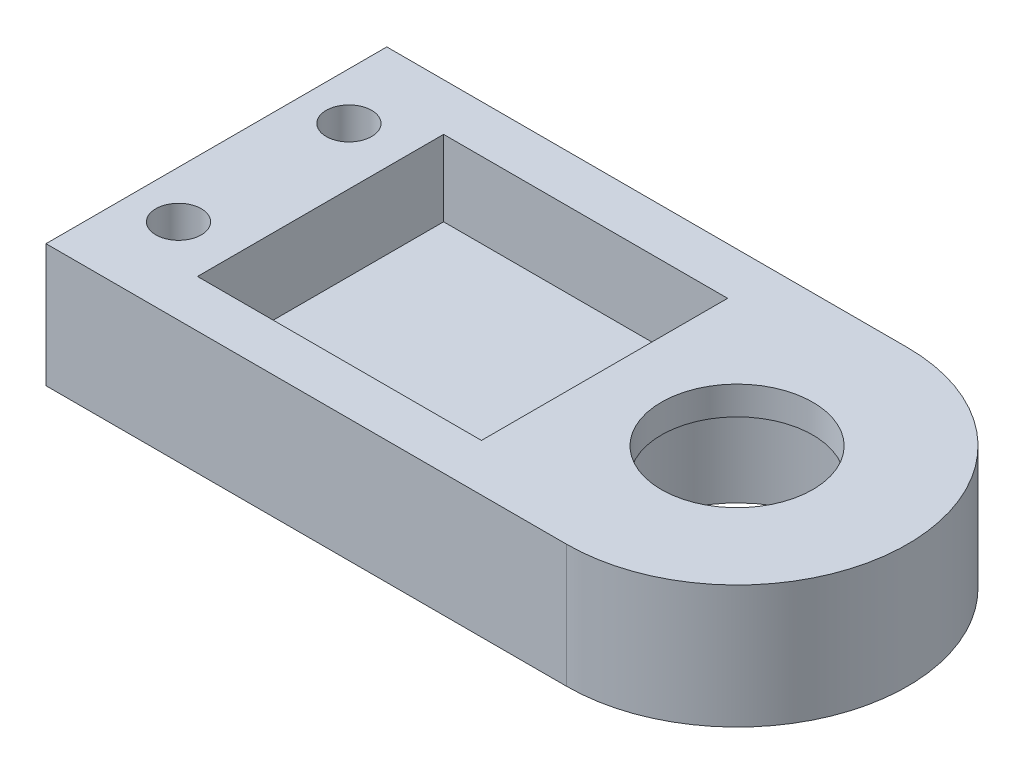
ISO-10303-21;
HEADER;
FILE_DESCRIPTION(('STEP AP214'),'2;1');
FILE_NAME('part.step','',(''),(''),'','','');
FILE_SCHEMA(('AUTOMOTIVE_DESIGN { 1 0 10303 214 1 1 1 1 }'));
ENDSEC;
DATA;
#1=APPLICATION_CONTEXT('core data for automotive mechanical design processes');
#2=APPLICATION_PROTOCOL_DEFINITION('international standard','automotive_design',2000,#1);
#3=PRODUCT_CONTEXT('',#1,'mechanical');
#4=PRODUCT('Part','Part','',(#3));
#5=PRODUCT_RELATED_PRODUCT_CATEGORY('part','',(#4));
#6=PRODUCT_DEFINITION_FORMATION('','',#4);
#7=PRODUCT_DEFINITION_CONTEXT('part definition',#1,'design');
#8=PRODUCT_DEFINITION('design','',#6,#7);
#9=PRODUCT_DEFINITION_SHAPE('','',#8);
#10=(LENGTH_UNIT() NAMED_UNIT(*) SI_UNIT(.MILLI.,.METRE.));
#11=(NAMED_UNIT(*) PLANE_ANGLE_UNIT() SI_UNIT($,.RADIAN.));
#12=(NAMED_UNIT(*) SI_UNIT($,.STERADIAN.) SOLID_ANGLE_UNIT());
#13=UNCERTAINTY_MEASURE_WITH_UNIT(LENGTH_MEASURE(1.E-05),#10,'distance_accuracy_value','');
#14=(GEOMETRIC_REPRESENTATION_CONTEXT(3) GLOBAL_UNCERTAINTY_ASSIGNED_CONTEXT((#13)) GLOBAL_UNIT_ASSIGNED_CONTEXT((#10,
#11,#12)) REPRESENTATION_CONTEXT('',''));
#15=CARTESIAN_POINT('',(0.,0.,0.));
#16=DIRECTION('',(0.,0.,1.));
#17=DIRECTION('',(1.,0.,0.));
#18=AXIS2_PLACEMENT_3D('',#15,#16,#17);
#19=CARTESIAN_POINT('',(5.5,31.3,0.));
#20=DIRECTION('',(0.,-1.,0.));
#21=DIRECTION('',(0.,0.,-1.));
#22=AXIS2_PLACEMENT_3D('',#19,#20,#21);
#23=CYLINDRICAL_SURFACE('',#22,9.);
#24=CARTESIAN_POINT('',(5.5,24.8,0.));
#25=DIRECTION('',(0.,1.,0.));
#26=DIRECTION('',(0.,0.,1.));
#27=AXIS2_PLACEMENT_3D('',#24,#25,#26);
#28=CIRCLE('',#27,9.);
#29=CARTESIAN_POINT('',(5.5,24.8,9.));
#30=VERTEX_POINT('',#29);
#31=CARTESIAN_POINT('',(5.5,24.8,-9.));
#32=VERTEX_POINT('',#31);
#33=EDGE_CURVE('E192',#30,#32,#28,.T.);
#34=ORIENTED_EDGE('',*,*,#33,.T.);
#35=DIRECTION('',(0.,-1.,0.));
#36=VECTOR('',#35,1.);
#37=CARTESIAN_POINT('',(5.5,31.3,-9.));
#38=LINE('',#37,#36);
#39=CARTESIAN_POINT('',(5.5,31.3,-9.));
#40=VERTEX_POINT('',#39);
#41=EDGE_CURVE('E11',#40,#32,#38,.T.);
#42=ORIENTED_EDGE('',*,*,#41,.F.);
#43=CARTESIAN_POINT('',(5.5,31.3,0.));
#44=DIRECTION('',(0.,1.,0.));
#45=DIRECTION('',(0.,0.,1.));
#46=AXIS2_PLACEMENT_3D('',#43,#44,#45);
#47=CIRCLE('',#46,9.);
#48=CARTESIAN_POINT('',(5.5,31.3,9.));
#49=VERTEX_POINT('',#48);
#50=EDGE_CURVE('E196',#49,#40,#47,.T.);
#51=ORIENTED_EDGE('',*,*,#50,.F.);
#52=DIRECTION('',(0.,-1.,0.));
#53=VECTOR('',#52,1.);
#54=CARTESIAN_POINT('',(5.5,31.3,9.));
#55=LINE('',#54,#53);
#56=EDGE_CURVE('E206',#49,#30,#55,.T.);
#57=ORIENTED_EDGE('',*,*,#56,.T.);
#58=EDGE_LOOP('',(#34,#42,#51,#57));
#59=FACE_BOUND('',#58,.T.);
#60=ADVANCED_FACE('F39',(#59),#23,.T.);
#61=CARTESIAN_POINT('',(5.5,31.3,-9.));
#62=DIRECTION('',(0.,0.,1.));
#63=DIRECTION('',(1.,0.,0.));
#64=AXIS2_PLACEMENT_3D('',#61,#62,#63);
#65=PLANE('',#64);
#66=DIRECTION('',(-1.,0.,0.));
#67=VECTOR('',#66,1.);
#68=CARTESIAN_POINT('',(5.5,24.8,-9.));
#69=LINE('',#68,#67);
#70=CARTESIAN_POINT('',(-22.,24.8,-9.));
#71=VERTEX_POINT('',#70);
#72=EDGE_CURVE('E210',#32,#71,#69,.T.);
#73=ORIENTED_EDGE('',*,*,#72,.T.);
#74=DIRECTION('',(0.,-1.,0.));
#75=VECTOR('',#74,1.);
#76=CARTESIAN_POINT('',(-22.,31.3,-9.));
#77=LINE('',#76,#75);
#78=CARTESIAN_POINT('',(-22.,31.3,-9.));
#79=VERTEX_POINT('',#78);
#80=EDGE_CURVE('E47',#79,#71,#77,.T.);
#81=ORIENTED_EDGE('',*,*,#80,.F.);
#82=DIRECTION('',(-1.,0.,0.));
#83=VECTOR('',#82,1.);
#84=CARTESIAN_POINT('',(5.5,31.3,-9.));
#85=LINE('',#84,#83);
#86=EDGE_CURVE('E91',#40,#79,#85,.T.);
#87=ORIENTED_EDGE('',*,*,#86,.F.);
#88=ORIENTED_EDGE('',*,*,#41,.T.);
#89=EDGE_LOOP('',(#73,#81,#87,#88));
#90=FACE_BOUND('',#89,.T.);
#91=ADVANCED_FACE('F245',(#90),#65,.F.);
#92=CARTESIAN_POINT('',(-22.,31.3,-9.));
#93=DIRECTION('',(1.,0.,0.));
#94=DIRECTION('',(0.,0.,-1.));
#95=AXIS2_PLACEMENT_3D('',#92,#93,#94);
#96=PLANE('',#95);
#97=DIRECTION('',(0.,0.,1.));
#98=VECTOR('',#97,1.);
#99=CARTESIAN_POINT('',(-22.,24.8,-9.));
#100=LINE('',#99,#98);
#101=CARTESIAN_POINT('',(-22.,24.8,9.));
#102=VERTEX_POINT('',#101);
#103=EDGE_CURVE('E213',#71,#102,#100,.T.);
#104=ORIENTED_EDGE('',*,*,#103,.T.);
#105=DIRECTION('',(0.,-1.,0.));
#106=VECTOR('',#105,1.);
#107=CARTESIAN_POINT('',(-22.,31.3,9.));
#108=LINE('',#107,#106);
#109=CARTESIAN_POINT('',(-22.,31.3,9.));
#110=VERTEX_POINT('',#109);
#111=EDGE_CURVE('E220',#110,#102,#108,.T.);
#112=ORIENTED_EDGE('',*,*,#111,.F.);
#113=DIRECTION('',(0.,0.,1.));
#114=VECTOR('',#113,1.);
#115=CARTESIAN_POINT('',(-22.,31.3,-9.));
#116=LINE('',#115,#114);
#117=EDGE_CURVE('E201',#79,#110,#116,.T.);
#118=ORIENTED_EDGE('',*,*,#117,.F.);
#119=ORIENTED_EDGE('',*,*,#80,.T.);
#120=EDGE_LOOP('',(#104,#112,#118,#119));
#121=FACE_BOUND('',#120,.T.);
#122=ADVANCED_FACE('F227',(#121),#96,.F.);
#123=CARTESIAN_POINT('',(-22.,31.3,9.));
#124=DIRECTION('',(0.,0.,-1.));
#125=DIRECTION('',(-1.,0.,0.));
#126=AXIS2_PLACEMENT_3D('',#123,#124,#125);
#127=PLANE('',#126);
#128=DIRECTION('',(1.,0.,0.));
#129=VECTOR('',#128,1.);
#130=CARTESIAN_POINT('',(-22.,24.8,9.));
#131=LINE('',#130,#129);
#132=EDGE_CURVE('E84',#102,#30,#131,.T.);
#133=ORIENTED_EDGE('',*,*,#132,.T.);
#134=ORIENTED_EDGE('',*,*,#56,.F.);
#135=DIRECTION('',(1.,0.,0.));
#136=VECTOR('',#135,1.);
#137=CARTESIAN_POINT('',(-22.,31.3,9.));
#138=LINE('',#137,#136);
#139=EDGE_CURVE('E63',#110,#49,#138,.T.);
#140=ORIENTED_EDGE('',*,*,#139,.F.);
#141=ORIENTED_EDGE('',*,*,#111,.T.);
#142=EDGE_LOOP('',(#133,#134,#140,#141));
#143=FACE_BOUND('',#142,.T.);
#144=ADVANCED_FACE('F235',(#143),#127,.F.);
#145=CARTESIAN_POINT('',(5.5,31.3,0.));
#146=DIRECTION('',(0.,1.,0.));
#147=DIRECTION('',(0.,0.,1.));
#148=AXIS2_PLACEMENT_3D('',#145,#146,#147);
#149=PLANE('',#148);
#150=DIRECTION('',(0.,0.,1.));
#151=VECTOR('',#150,1.);
#152=CARTESIAN_POINT('',(-16.5,31.3,6.5));
#153=LINE('',#152,#151);
#154=CARTESIAN_POINT('',(-16.5,31.3,-6.5));
#155=VERTEX_POINT('',#154);
#156=CARTESIAN_POINT('',(-16.5,31.3,6.5));
#157=VERTEX_POINT('',#156);
#158=EDGE_CURVE('E54',#155,#157,#153,.T.);
#159=ORIENTED_EDGE('',*,*,#158,.F.);
#160=DIRECTION('',(-1.,0.,0.));
#161=VECTOR('',#160,1.);
#162=CARTESIAN_POINT('',(-16.5,31.3,-6.5));
#163=LINE('',#162,#161);
#164=CARTESIAN_POINT('',(-1.5,31.3,-6.5));
#165=VERTEX_POINT('',#164);
#166=EDGE_CURVE('E136',#165,#155,#163,.T.);
#167=ORIENTED_EDGE('',*,*,#166,.F.);
#168=DIRECTION('',(0.,0.,-1.));
#169=VECTOR('',#168,1.);
#170=CARTESIAN_POINT('',(-1.5,31.3,6.5));
#171=LINE('',#170,#169);
#172=CARTESIAN_POINT('',(-1.5,31.3,6.5));
#173=VERTEX_POINT('',#172);
#174=EDGE_CURVE('E140',#173,#165,#171,.T.);
#175=ORIENTED_EDGE('',*,*,#174,.F.);
#176=DIRECTION('',(1.,0.,0.));
#177=VECTOR('',#176,1.);
#178=CARTESIAN_POINT('',(-16.5,31.3,6.5));
#179=LINE('',#178,#177);
#180=EDGE_CURVE('E149',#157,#173,#179,.T.);
#181=ORIENTED_EDGE('',*,*,#180,.F.);
#182=EDGE_LOOP('',(#159,#167,#175,#181));
#183=FACE_BOUND('',#182,.T.);
#184=CARTESIAN_POINT('',(-19.5,31.3,-4.5));
#185=DIRECTION('',(0.,1.,0.));
#186=DIRECTION('',(0.,0.,1.));
#187=AXIS2_PLACEMENT_3D('',#184,#185,#186);
#188=CIRCLE('',#187,1.19999999999999);
#189=CARTESIAN_POINT('',(-19.5,31.3,-3.30000000000001));
#190=VERTEX_POINT('',#189);
#191=EDGE_CURVE('E158',#190,#190,#188,.T.);
#192=ORIENTED_EDGE('',*,*,#191,.F.);
#193=EDGE_LOOP('',(#192));
#194=FACE_BOUND('',#193,.T.);
#195=CARTESIAN_POINT('',(-19.5,31.3,4.5));
#196=DIRECTION('',(0.,1.,0.));
#197=DIRECTION('',(0.,0.,1.));
#198=AXIS2_PLACEMENT_3D('',#195,#196,#197);
#199=CIRCLE('',#198,1.19999999999999);
#200=CARTESIAN_POINT('',(-19.5,31.3,5.69999999999999));
#201=VERTEX_POINT('',#200);
#202=EDGE_CURVE('E171',#201,#201,#199,.T.);
#203=ORIENTED_EDGE('',*,*,#202,.F.);
#204=EDGE_LOOP('',(#203));
#205=FACE_BOUND('',#204,.T.);
#206=CARTESIAN_POINT('',(5.5,31.3,0.));
#207=DIRECTION('',(0.,1.,0.));
#208=DIRECTION('',(0.,0.,1.));
#209=AXIS2_PLACEMENT_3D('',#206,#207,#208);
#210=CIRCLE('',#209,4.);
#211=CARTESIAN_POINT('',(5.5,31.3,4.));
#212=VERTEX_POINT('',#211);
#213=EDGE_CURVE('E180',#212,#212,#210,.T.);
#214=ORIENTED_EDGE('',*,*,#213,.F.);
#215=EDGE_LOOP('',(#214));
#216=FACE_BOUND('',#215,.T.);
#217=ORIENTED_EDGE('',*,*,#50,.T.);
#218=ORIENTED_EDGE('',*,*,#86,.T.);
#219=ORIENTED_EDGE('',*,*,#117,.T.);
#220=ORIENTED_EDGE('',*,*,#139,.T.);
#221=EDGE_LOOP('',(#217,#218,#219,#220));
#222=FACE_BOUND('',#221,.T.);
#223=ADVANCED_FACE('F237',(#183,#194,#205,#216,#222),#149,.T.);
#224=CARTESIAN_POINT('',(5.5,24.8,0.));
#225=DIRECTION('',(0.,1.,0.));
#226=DIRECTION('',(0.,0.,1.));
#227=AXIS2_PLACEMENT_3D('',#224,#225,#226);
#228=PLANE('',#227);
#229=CARTESIAN_POINT('',(-19.5,24.8,-4.5));
#230=DIRECTION('',(0.,1.,0.));
#231=DIRECTION('',(0.,0.,1.));
#232=AXIS2_PLACEMENT_3D('',#229,#230,#231);
#233=CIRCLE('',#232,1.19999999999999);
#234=CARTESIAN_POINT('',(-19.5,24.8,-3.30000000000001));
#235=VERTEX_POINT('',#234);
#236=EDGE_CURVE('E167',#235,#235,#233,.T.);
#237=ORIENTED_EDGE('',*,*,#236,.T.);
#238=EDGE_LOOP('',(#237));
#239=FACE_BOUND('',#238,.T.);
#240=CARTESIAN_POINT('',(-19.5,24.8,4.5));
#241=DIRECTION('',(0.,1.,0.));
#242=DIRECTION('',(0.,0.,1.));
#243=AXIS2_PLACEMENT_3D('',#240,#241,#242);
#244=CIRCLE('',#243,1.19999999999999);
#245=CARTESIAN_POINT('',(-19.5,24.8,5.69999999999999));
#246=VERTEX_POINT('',#245);
#247=EDGE_CURVE('E175',#246,#246,#244,.T.);
#248=ORIENTED_EDGE('',*,*,#247,.T.);
#249=EDGE_LOOP('',(#248));
#250=FACE_BOUND('',#249,.T.);
#251=CARTESIAN_POINT('',(5.5,24.8,0.));
#252=DIRECTION('',(0.,1.,0.));
#253=DIRECTION('',(0.,0.,1.));
#254=AXIS2_PLACEMENT_3D('',#251,#252,#253);
#255=CIRCLE('',#254,5.5);
#256=CARTESIAN_POINT('',(5.5,24.8,5.5));
#257=VERTEX_POINT('',#256);
#258=EDGE_CURVE('E184',#257,#257,#255,.T.);
#259=ORIENTED_EDGE('',*,*,#258,.T.);
#260=EDGE_LOOP('',(#259));
#261=FACE_BOUND('',#260,.T.);
#262=ORIENTED_EDGE('',*,*,#33,.F.);
#263=ORIENTED_EDGE('',*,*,#132,.F.);
#264=ORIENTED_EDGE('',*,*,#103,.F.);
#265=ORIENTED_EDGE('',*,*,#72,.F.);
#266=EDGE_LOOP('',(#262,#263,#264,#265));
#267=FACE_BOUND('',#266,.T.);
#268=ADVANCED_FACE('F231',(#239,#250,#261,#267),#228,.F.);
#269=CARTESIAN_POINT('',(5.5,29.8,0.));
#270=DIRECTION('',(0.,-1.,0.));
#271=DIRECTION('',(0.,0.,-1.));
#272=AXIS2_PLACEMENT_3D('',#269,#270,#271);
#273=CYLINDRICAL_SURFACE('',#272,5.5);
#274=CARTESIAN_POINT('',(5.5,29.8,0.));
#275=DIRECTION('',(0.,1.,0.));
#276=DIRECTION('',(0.,0.,1.));
#277=AXIS2_PLACEMENT_3D('',#274,#275,#276);
#278=CIRCLE('',#277,5.5);
#279=CARTESIAN_POINT('',(5.5,29.8,5.5));
#280=VERTEX_POINT('',#279);
#281=EDGE_CURVE('E188',#280,#280,#278,.T.);
#282=ORIENTED_EDGE('',*,*,#281,.T.);
#283=EDGE_LOOP('',(#282));
#284=FACE_BOUND('',#283,.T.);
#285=ORIENTED_EDGE('',*,*,#258,.F.);
#286=EDGE_LOOP('',(#285));
#287=FACE_BOUND('',#286,.T.);
#288=ADVANCED_FACE('F268',(#284,#287),#273,.F.);
#289=CARTESIAN_POINT('',(5.5,29.8,0.));
#290=DIRECTION('',(0.,1.,0.));
#291=DIRECTION('',(0.,0.,1.));
#292=AXIS2_PLACEMENT_3D('',#289,#290,#291);
#293=PLANE('',#292);
#294=CARTESIAN_POINT('',(5.5,29.8,0.));
#295=DIRECTION('',(0.,1.,0.));
#296=DIRECTION('',(0.,0.,1.));
#297=AXIS2_PLACEMENT_3D('',#294,#295,#296);
#298=CIRCLE('',#297,4.);
#299=CARTESIAN_POINT('',(5.5,29.8,4.));
#300=VERTEX_POINT('',#299);
#301=EDGE_CURVE('E179',#300,#300,#298,.T.);
#302=ORIENTED_EDGE('',*,*,#301,.T.);
#303=EDGE_LOOP('',(#302));
#304=FACE_BOUND('',#303,.T.);
#305=ORIENTED_EDGE('',*,*,#281,.F.);
#306=EDGE_LOOP('',(#305));
#307=FACE_BOUND('',#306,.T.);
#308=ADVANCED_FACE('F273',(#304,#307),#293,.F.);
#309=CARTESIAN_POINT('',(5.5,31.3,0.));
#310=DIRECTION('',(0.,-1.,0.));
#311=DIRECTION('',(0.,0.,-1.));
#312=AXIS2_PLACEMENT_3D('',#309,#310,#311);
#313=CYLINDRICAL_SURFACE('',#312,4.);
#314=ORIENTED_EDGE('',*,*,#213,.T.);
#315=EDGE_LOOP('',(#314));
#316=FACE_BOUND('',#315,.T.);
#317=ORIENTED_EDGE('',*,*,#301,.F.);
#318=EDGE_LOOP('',(#317));
#319=FACE_BOUND('',#318,.T.);
#320=ADVANCED_FACE('F285',(#316,#319),#313,.F.);
#321=CARTESIAN_POINT('',(-19.5,31.3,4.5));
#322=DIRECTION('',(0.,1.,0.));
#323=DIRECTION('',(0.,0.,1.));
#324=AXIS2_PLACEMENT_3D('',#321,#322,#323);
#325=CYLINDRICAL_SURFACE('',#324,1.19999999999999);
#326=ORIENTED_EDGE('',*,*,#247,.F.);
#327=EDGE_LOOP('',(#326));
#328=FACE_BOUND('',#327,.T.);
#329=ORIENTED_EDGE('',*,*,#202,.T.);
#330=EDGE_LOOP('',(#329));
#331=FACE_BOUND('',#330,.T.);
#332=ADVANCED_FACE('F295',(#328,#331),#325,.F.);
#333=CARTESIAN_POINT('',(-19.5,31.3,-4.5));
#334=DIRECTION('',(0.,1.,0.));
#335=DIRECTION('',(0.,0.,1.));
#336=AXIS2_PLACEMENT_3D('',#333,#334,#335);
#337=CYLINDRICAL_SURFACE('',#336,1.19999999999999);
#338=ORIENTED_EDGE('',*,*,#236,.F.);
#339=EDGE_LOOP('',(#338));
#340=FACE_BOUND('',#339,.T.);
#341=ORIENTED_EDGE('',*,*,#191,.T.);
#342=EDGE_LOOP('',(#341));
#343=FACE_BOUND('',#342,.T.);
#344=ADVANCED_FACE('F305',(#340,#343),#337,.F.);
#345=CARTESIAN_POINT('',(-16.5,27.3,6.5));
#346=DIRECTION('',(-1.,0.,0.));
#347=DIRECTION('',(0.,0.,1.));
#348=AXIS2_PLACEMENT_3D('',#345,#346,#347);
#349=PLANE('',#348);
#350=ORIENTED_EDGE('',*,*,#158,.T.);
#351=DIRECTION('',(0.,1.,0.));
#352=VECTOR('',#351,1.);
#353=CARTESIAN_POINT('',(-16.5,27.3,6.5));
#354=LINE('',#353,#352);
#355=CARTESIAN_POINT('',(-16.5,27.3,6.5));
#356=VERTEX_POINT('',#355);
#357=EDGE_CURVE('E111',#356,#157,#354,.T.);
#358=ORIENTED_EDGE('',*,*,#357,.F.);
#359=DIRECTION('',(0.,0.,1.));
#360=VECTOR('',#359,1.);
#361=CARTESIAN_POINT('',(-16.5,27.3,6.5));
#362=LINE('',#361,#360);
#363=CARTESIAN_POINT('',(-16.5,27.3,-6.5));
#364=VERTEX_POINT('',#363);
#365=EDGE_CURVE('E115',#364,#356,#362,.T.);
#366=ORIENTED_EDGE('',*,*,#365,.F.);
#367=DIRECTION('',(0.,1.,0.));
#368=VECTOR('',#367,1.);
#369=CARTESIAN_POINT('',(-16.5,27.3,-6.5));
#370=LINE('',#369,#368);
#371=EDGE_CURVE('E155',#364,#155,#370,.T.);
#372=ORIENTED_EDGE('',*,*,#371,.T.);
#373=EDGE_LOOP('',(#350,#358,#366,#372));
#374=FACE_BOUND('',#373,.T.);
#375=ADVANCED_FACE('F113',(#374),#349,.F.);
#376=CARTESIAN_POINT('',(-16.5,27.3,-6.5));
#377=DIRECTION('',(0.,0.,-1.));
#378=DIRECTION('',(-1.,0.,0.));
#379=AXIS2_PLACEMENT_3D('',#376,#377,#378);
#380=PLANE('',#379);
#381=ORIENTED_EDGE('',*,*,#166,.T.);
#382=ORIENTED_EDGE('',*,*,#371,.F.);
#383=DIRECTION('',(-1.,0.,0.));
#384=VECTOR('',#383,1.);
#385=CARTESIAN_POINT('',(-16.5,27.3,-6.5));
#386=LINE('',#385,#384);
#387=CARTESIAN_POINT('',(-1.5,27.3,-6.5));
#388=VERTEX_POINT('',#387);
#389=EDGE_CURVE('E122',#388,#364,#386,.T.);
#390=ORIENTED_EDGE('',*,*,#389,.F.);
#391=DIRECTION('',(0.,1.,0.));
#392=VECTOR('',#391,1.);
#393=CARTESIAN_POINT('',(-1.5,27.3,-6.5));
#394=LINE('',#393,#392);
#395=EDGE_CURVE('E159',#388,#165,#394,.T.);
#396=ORIENTED_EDGE('',*,*,#395,.T.);
#397=EDGE_LOOP('',(#381,#382,#390,#396));
#398=FACE_BOUND('',#397,.T.);
#399=ADVANCED_FACE('F335',(#398),#380,.F.);
#400=CARTESIAN_POINT('',(-1.5,27.3,6.5));
#401=DIRECTION('',(1.,0.,0.));
#402=DIRECTION('',(0.,0.,-1.));
#403=AXIS2_PLACEMENT_3D('',#400,#401,#402);
#404=PLANE('',#403);
#405=ORIENTED_EDGE('',*,*,#174,.T.);
#406=ORIENTED_EDGE('',*,*,#395,.F.);
#407=DIRECTION('',(0.,0.,-1.));
#408=VECTOR('',#407,1.);
#409=CARTESIAN_POINT('',(-1.5,27.3,6.5));
#410=LINE('',#409,#408);
#411=CARTESIAN_POINT('',(-1.5,27.3,6.5));
#412=VERTEX_POINT('',#411);
#413=EDGE_CURVE('E131',#412,#388,#410,.T.);
#414=ORIENTED_EDGE('',*,*,#413,.F.);
#415=DIRECTION('',(0.,1.,0.));
#416=VECTOR('',#415,1.);
#417=CARTESIAN_POINT('',(-1.5,27.3,6.5));
#418=LINE('',#417,#416);
#419=EDGE_CURVE('E121',#412,#173,#418,.T.);
#420=ORIENTED_EDGE('',*,*,#419,.T.);
#421=EDGE_LOOP('',(#405,#406,#414,#420));
#422=FACE_BOUND('',#421,.T.);
#423=ADVANCED_FACE('F344',(#422),#404,.F.);
#424=CARTESIAN_POINT('',(-16.5,27.3,6.5));
#425=DIRECTION('',(0.,0.,1.));
#426=DIRECTION('',(1.,0.,0.));
#427=AXIS2_PLACEMENT_3D('',#424,#425,#426);
#428=PLANE('',#427);
#429=ORIENTED_EDGE('',*,*,#180,.T.);
#430=ORIENTED_EDGE('',*,*,#419,.F.);
#431=DIRECTION('',(1.,0.,0.));
#432=VECTOR('',#431,1.);
#433=CARTESIAN_POINT('',(-16.5,27.3,6.5));
#434=LINE('',#433,#432);
#435=EDGE_CURVE('E125',#356,#412,#434,.T.);
#436=ORIENTED_EDGE('',*,*,#435,.F.);
#437=ORIENTED_EDGE('',*,*,#357,.T.);
#438=EDGE_LOOP('',(#429,#430,#436,#437));
#439=FACE_BOUND('',#438,.T.);
#440=ADVANCED_FACE('F126',(#439),#428,.F.);
#441=CARTESIAN_POINT('',(0.,27.3,0.));
#442=DIRECTION('',(0.,-1.,0.));
#443=DIRECTION('',(0.,0.,-1.));
#444=AXIS2_PLACEMENT_3D('',#441,#442,#443);
#445=PLANE('',#444);
#446=ORIENTED_EDGE('',*,*,#365,.T.);
#447=ORIENTED_EDGE('',*,*,#435,.T.);
#448=ORIENTED_EDGE('',*,*,#413,.T.);
#449=ORIENTED_EDGE('',*,*,#389,.T.);
#450=EDGE_LOOP('',(#446,#447,#448,#449));
#451=FACE_BOUND('',#450,.T.);
#452=ADVANCED_FACE('F133',(#451),#445,.F.);
#453=CLOSED_SHELL('',(#60,#91,#122,#144,#223,#268,#288,#308,#320,#332,#344,#375,#399,#423,#440,#452));
#454=MANIFOLD_SOLID_BREP('B2',#453);
#455=ADVANCED_BREP_SHAPE_REPRESENTATION('',(#18,#454),#14);
#456=SHAPE_DEFINITION_REPRESENTATION(#9,#455);
ENDSEC;
END-ISO-10303-21;
